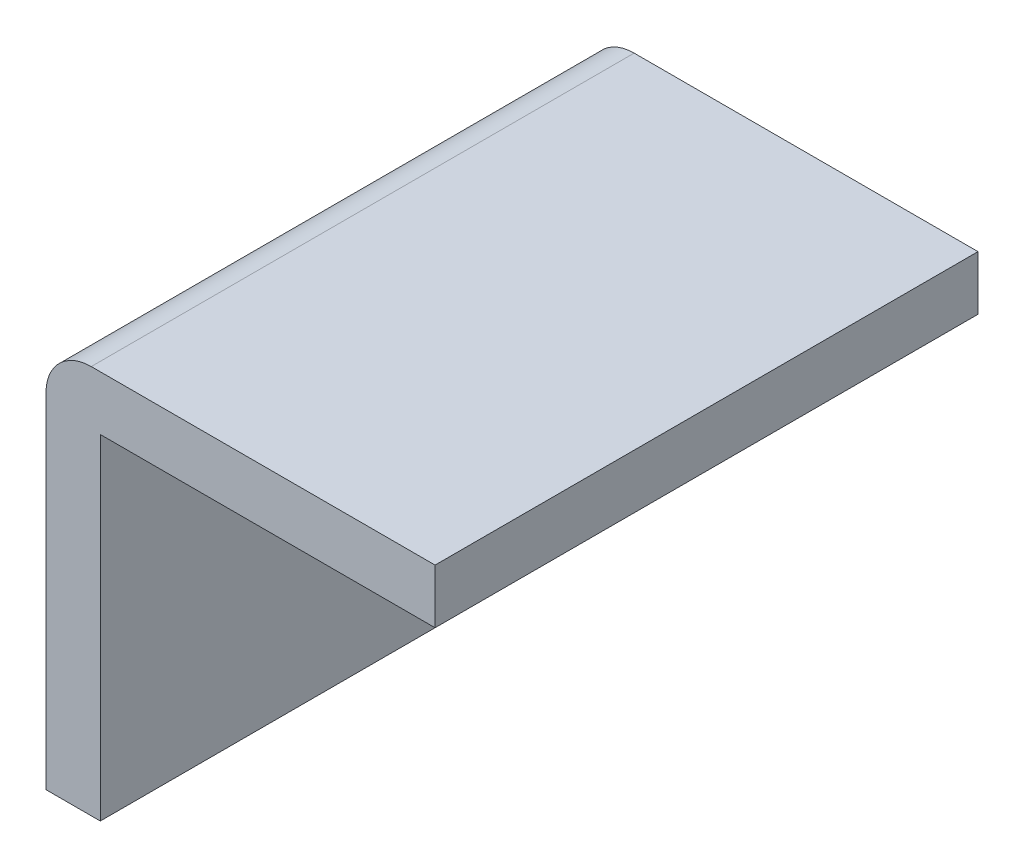
ISO-10303-21;
HEADER;
FILE_DESCRIPTION(('STEP AP214'),'2;1');
FILE_NAME('part.step','',(''),(''),'','','');
FILE_SCHEMA(('AUTOMOTIVE_DESIGN { 1 0 10303 214 1 1 1 1 }'));
ENDSEC;
DATA;
#1=APPLICATION_CONTEXT('core data for automotive mechanical design processes');
#2=APPLICATION_PROTOCOL_DEFINITION('international standard','automotive_design',2000,#1);
#3=PRODUCT_CONTEXT('',#1,'mechanical');
#4=PRODUCT('Part','Part','',(#3));
#5=PRODUCT_RELATED_PRODUCT_CATEGORY('part','',(#4));
#6=PRODUCT_DEFINITION_FORMATION('','',#4);
#7=PRODUCT_DEFINITION_CONTEXT('part definition',#1,'design');
#8=PRODUCT_DEFINITION('design','',#6,#7);
#9=PRODUCT_DEFINITION_SHAPE('','',#8);
#10=(LENGTH_UNIT() NAMED_UNIT(*) SI_UNIT(.MILLI.,.METRE.));
#11=(NAMED_UNIT(*) PLANE_ANGLE_UNIT() SI_UNIT($,.RADIAN.));
#12=(NAMED_UNIT(*) SI_UNIT($,.STERADIAN.) SOLID_ANGLE_UNIT());
#13=UNCERTAINTY_MEASURE_WITH_UNIT(LENGTH_MEASURE(1.E-05),#10,'distance_accuracy_value','');
#14=(GEOMETRIC_REPRESENTATION_CONTEXT(3) GLOBAL_UNCERTAINTY_ASSIGNED_CONTEXT((#13)) GLOBAL_UNIT_ASSIGNED_CONTEXT((#10,
#11,#12)) REPRESENTATION_CONTEXT('',''));
#15=CARTESIAN_POINT('',(0.,0.,0.));
#16=DIRECTION('',(0.,0.,1.));
#17=DIRECTION('',(1.,0.,0.));
#18=AXIS2_PLACEMENT_3D('',#15,#16,#17);
#19=CARTESIAN_POINT('',(-1.5,0.,30.));
#20=DIRECTION('',(-1.,0.,0.));
#21=DIRECTION('',(0.,0.,1.));
#22=AXIS2_PLACEMENT_3D('',#19,#20,#21);
#23=PLANE('',#22);
#24=DIRECTION('',(0.,1.,0.));
#25=VECTOR('',#24,1.);
#26=CARTESIAN_POINT('',(-1.5,0.,0.));
#27=LINE('',#26,#25);
#28=CARTESIAN_POINT('',(-1.5,0.,0.));
#29=VERTEX_POINT('',#28);
#30=CARTESIAN_POINT('',(-1.5,19.,0.));
#31=VERTEX_POINT('',#30);
#32=EDGE_CURVE('E125',#29,#31,#27,.T.);
#33=ORIENTED_EDGE('',*,*,#32,.F.);
#34=DIRECTION('',(0.,0.,-1.));
#35=VECTOR('',#34,1.);
#36=CARTESIAN_POINT('',(-1.5,0.,30.));
#37=LINE('',#36,#35);
#38=CARTESIAN_POINT('',(-1.5,0.,30.));
#39=VERTEX_POINT('',#38);
#40=EDGE_CURVE('E11',#39,#29,#37,.T.);
#41=ORIENTED_EDGE('',*,*,#40,.F.);
#42=DIRECTION('',(0.,1.,0.));
#43=VECTOR('',#42,1.);
#44=CARTESIAN_POINT('',(-1.5,0.,30.));
#45=LINE('',#44,#43);
#46=CARTESIAN_POINT('',(-1.5,19.,30.));
#47=VERTEX_POINT('',#46);
#48=EDGE_CURVE('E140',#39,#47,#45,.T.);
#49=ORIENTED_EDGE('',*,*,#48,.T.);
#50=DIRECTION('',(0.,0.,-1.));
#51=VECTOR('',#50,1.);
#52=CARTESIAN_POINT('',(-1.5,19.,30.));
#53=LINE('',#52,#51);
#54=EDGE_CURVE('E54',#47,#31,#53,.T.);
#55=ORIENTED_EDGE('',*,*,#54,.T.);
#56=EDGE_LOOP('',(#33,#41,#49,#55));
#57=FACE_BOUND('',#56,.T.);
#58=ADVANCED_FACE('F38',(#57),#23,.T.);
#59=CARTESIAN_POINT('',(0.,0.,30.));
#60=DIRECTION('',(0.,1.,0.));
#61=DIRECTION('',(0.,0.,1.));
#62=AXIS2_PLACEMENT_3D('',#59,#60,#61);
#63=PLANE('',#62);
#64=DIRECTION('',(1.,0.,0.));
#65=VECTOR('',#64,1.);
#66=CARTESIAN_POINT('',(0.,0.,0.));
#67=LINE('',#66,#65);
#68=CARTESIAN_POINT('',(1.5,0.,0.));
#69=VERTEX_POINT('',#68);
#70=EDGE_CURVE('E127',#29,#69,#67,.T.);
#71=ORIENTED_EDGE('',*,*,#70,.T.);
#72=DIRECTION('',(0.,0.,-1.));
#73=VECTOR('',#72,1.);
#74=CARTESIAN_POINT('',(1.5,0.,30.));
#75=LINE('',#74,#73);
#76=CARTESIAN_POINT('',(1.5,0.,30.));
#77=VERTEX_POINT('',#76);
#78=EDGE_CURVE('E46',#77,#69,#75,.T.);
#79=ORIENTED_EDGE('',*,*,#78,.F.);
#80=DIRECTION('',(1.,0.,0.));
#81=VECTOR('',#80,1.);
#82=CARTESIAN_POINT('',(0.,0.,30.));
#83=LINE('',#82,#81);
#84=EDGE_CURVE('E161',#39,#77,#83,.T.);
#85=ORIENTED_EDGE('',*,*,#84,.F.);
#86=ORIENTED_EDGE('',*,*,#40,.T.);
#87=EDGE_LOOP('',(#71,#79,#85,#86));
#88=FACE_BOUND('',#87,.T.);
#89=ADVANCED_FACE('F176',(#88),#63,.F.);
#90=CARTESIAN_POINT('',(1.5,0.,30.));
#91=DIRECTION('',(-1.,0.,0.));
#92=DIRECTION('',(0.,0.,1.));
#93=AXIS2_PLACEMENT_3D('',#90,#91,#92);
#94=PLANE('',#93);
#95=DIRECTION('',(0.,1.,0.));
#96=VECTOR('',#95,1.);
#97=CARTESIAN_POINT('',(1.5,0.,0.));
#98=LINE('',#97,#96);
#99=CARTESIAN_POINT('',(1.5,18.5,0.));
#100=VERTEX_POINT('',#99);
#101=EDGE_CURVE('E129',#69,#100,#98,.T.);
#102=ORIENTED_EDGE('',*,*,#101,.T.);
#103=DIRECTION('',(0.,0.,-1.));
#104=VECTOR('',#103,1.);
#105=CARTESIAN_POINT('',(1.5,18.5,30.));
#106=LINE('',#105,#104);
#107=CARTESIAN_POINT('',(1.5,18.5,30.));
#108=VERTEX_POINT('',#107);
#109=EDGE_CURVE('E144',#108,#100,#106,.T.);
#110=ORIENTED_EDGE('',*,*,#109,.F.);
#111=DIRECTION('',(0.,1.,0.));
#112=VECTOR('',#111,1.);
#113=CARTESIAN_POINT('',(1.5,0.,30.));
#114=LINE('',#113,#112);
#115=EDGE_CURVE('E153',#77,#108,#114,.T.);
#116=ORIENTED_EDGE('',*,*,#115,.F.);
#117=ORIENTED_EDGE('',*,*,#78,.T.);
#118=EDGE_LOOP('',(#102,#110,#116,#117));
#119=FACE_BOUND('',#118,.T.);
#120=ADVANCED_FACE('F151',(#119),#94,.F.);
#121=CARTESIAN_POINT('',(0.,18.5,30.));
#122=DIRECTION('',(0.,1.,0.));
#123=DIRECTION('',(0.,0.,1.));
#124=AXIS2_PLACEMENT_3D('',#121,#122,#123);
#125=PLANE('',#124);
#126=DIRECTION('',(1.,0.,0.));
#127=VECTOR('',#126,1.);
#128=CARTESIAN_POINT('',(0.,18.5,0.));
#129=LINE('',#128,#127);
#130=CARTESIAN_POINT('',(20.,18.5,0.));
#131=VERTEX_POINT('',#130);
#132=EDGE_CURVE('E131',#100,#131,#129,.T.);
#133=ORIENTED_EDGE('',*,*,#132,.T.);
#134=DIRECTION('',(0.,0.,-1.));
#135=VECTOR('',#134,1.);
#136=CARTESIAN_POINT('',(20.,18.5,30.));
#137=LINE('',#136,#135);
#138=CARTESIAN_POINT('',(20.,18.5,30.));
#139=VERTEX_POINT('',#138);
#140=EDGE_CURVE('E107',#139,#131,#137,.T.);
#141=ORIENTED_EDGE('',*,*,#140,.F.);
#142=DIRECTION('',(1.,0.,0.));
#143=VECTOR('',#142,1.);
#144=CARTESIAN_POINT('',(0.,18.5,30.));
#145=LINE('',#144,#143);
#146=EDGE_CURVE('E116',#108,#139,#145,.T.);
#147=ORIENTED_EDGE('',*,*,#146,.F.);
#148=ORIENTED_EDGE('',*,*,#109,.T.);
#149=EDGE_LOOP('',(#133,#141,#147,#148));
#150=FACE_BOUND('',#149,.T.);
#151=ADVANCED_FACE('F160',(#150),#125,.F.);
#152=CARTESIAN_POINT('',(20.,0.,30.));
#153=DIRECTION('',(1.,0.,0.));
#154=DIRECTION('',(0.,0.,-1.));
#155=AXIS2_PLACEMENT_3D('',#152,#153,#154);
#156=PLANE('',#155);
#157=DIRECTION('',(0.,-1.,0.));
#158=VECTOR('',#157,1.);
#159=CARTESIAN_POINT('',(20.,0.,0.));
#160=LINE('',#159,#158);
#161=CARTESIAN_POINT('',(20.,21.5,0.));
#162=VERTEX_POINT('',#161);
#163=EDGE_CURVE('E103',#162,#131,#160,.T.);
#164=ORIENTED_EDGE('',*,*,#163,.F.);
#165=DIRECTION('',(0.,0.,-1.));
#166=VECTOR('',#165,1.);
#167=CARTESIAN_POINT('',(20.,21.5,30.));
#168=LINE('',#167,#166);
#169=CARTESIAN_POINT('',(20.,21.5,30.));
#170=VERTEX_POINT('',#169);
#171=EDGE_CURVE('E98',#170,#162,#168,.T.);
#172=ORIENTED_EDGE('',*,*,#171,.F.);
#173=DIRECTION('',(0.,-1.,0.));
#174=VECTOR('',#173,1.);
#175=CARTESIAN_POINT('',(20.,0.,30.));
#176=LINE('',#175,#174);
#177=EDGE_CURVE('E101',#170,#139,#176,.T.);
#178=ORIENTED_EDGE('',*,*,#177,.T.);
#179=ORIENTED_EDGE('',*,*,#140,.T.);
#180=EDGE_LOOP('',(#164,#172,#178,#179));
#181=FACE_BOUND('',#180,.T.);
#182=ADVANCED_FACE('F100',(#181),#156,.T.);
#183=CARTESIAN_POINT('',(0.,21.5,30.));
#184=DIRECTION('',(0.,1.,0.));
#185=DIRECTION('',(-1.,0.,0.));
#186=AXIS2_PLACEMENT_3D('',#183,#184,#185);
#187=PLANE('',#186);
#188=DIRECTION('',(1.,0.,0.));
#189=VECTOR('',#188,1.);
#190=CARTESIAN_POINT('',(0.,21.5,0.));
#191=LINE('',#190,#189);
#192=CARTESIAN_POINT('',(1.,21.5,0.));
#193=VERTEX_POINT('',#192);
#194=EDGE_CURVE('E135',#193,#162,#191,.T.);
#195=ORIENTED_EDGE('',*,*,#194,.F.);
#196=DIRECTION('',(0.,0.,-1.));
#197=VECTOR('',#196,1.);
#198=CARTESIAN_POINT('',(1.,21.5,30.));
#199=LINE('',#198,#197);
#200=CARTESIAN_POINT('',(1.,21.5,30.));
#201=VERTEX_POINT('',#200);
#202=EDGE_CURVE('E76',#201,#193,#199,.T.);
#203=ORIENTED_EDGE('',*,*,#202,.F.);
#204=DIRECTION('',(1.,0.,0.));
#205=VECTOR('',#204,1.);
#206=CARTESIAN_POINT('',(0.,21.5,30.));
#207=LINE('',#206,#205);
#208=EDGE_CURVE('E114',#201,#170,#207,.T.);
#209=ORIENTED_EDGE('',*,*,#208,.T.);
#210=ORIENTED_EDGE('',*,*,#171,.T.);
#211=EDGE_LOOP('',(#195,#203,#209,#210));
#212=FACE_BOUND('',#211,.T.);
#213=ADVANCED_FACE('F119',(#212),#187,.T.);
#214=CARTESIAN_POINT('',(1.,19.,30.));
#215=DIRECTION('',(0.,0.,-1.));
#216=DIRECTION('',(-1.,0.,0.));
#217=AXIS2_PLACEMENT_3D('',#214,#215,#216);
#218=CYLINDRICAL_SURFACE('',#217,2.5);
#219=CARTESIAN_POINT('',(1.,19.,0.));
#220=DIRECTION('',(0.,0.,1.));
#221=DIRECTION('',(1.,0.,0.));
#222=AXIS2_PLACEMENT_3D('',#219,#220,#221);
#223=CIRCLE('',#222,2.5);
#224=EDGE_CURVE('E137',#31,#193,#223,.F.);
#225=ORIENTED_EDGE('',*,*,#224,.F.);
#226=ORIENTED_EDGE('',*,*,#54,.F.);
#227=CARTESIAN_POINT('',(1.,19.,30.));
#228=DIRECTION('',(0.,0.,1.));
#229=DIRECTION('',(1.,0.,0.));
#230=AXIS2_PLACEMENT_3D('',#227,#228,#229);
#231=CIRCLE('',#230,2.5);
#232=EDGE_CURVE('E120',#47,#201,#231,.F.);
#233=ORIENTED_EDGE('',*,*,#232,.T.);
#234=ORIENTED_EDGE('',*,*,#202,.T.);
#235=EDGE_LOOP('',(#225,#226,#233,#234));
#236=FACE_BOUND('',#235,.T.);
#237=ADVANCED_FACE('F165',(#236),#218,.T.);
#238=CARTESIAN_POINT('',(0.,0.,30.));
#239=DIRECTION('',(0.,0.,1.));
#240=DIRECTION('',(1.,0.,0.));
#241=AXIS2_PLACEMENT_3D('',#238,#239,#240);
#242=PLANE('',#241);
#243=ORIENTED_EDGE('',*,*,#48,.F.);
#244=ORIENTED_EDGE('',*,*,#84,.T.);
#245=ORIENTED_EDGE('',*,*,#115,.T.);
#246=ORIENTED_EDGE('',*,*,#146,.T.);
#247=ORIENTED_EDGE('',*,*,#177,.F.);
#248=ORIENTED_EDGE('',*,*,#208,.F.);
#249=ORIENTED_EDGE('',*,*,#232,.F.);
#250=EDGE_LOOP('',(#243,#244,#245,#246,#247,#248,#249));
#251=FACE_BOUND('',#250,.T.);
#252=ADVANCED_FACE('F112',(#251),#242,.T.);
#253=CARTESIAN_POINT('',(0.,0.,0.));
#254=DIRECTION('',(0.,0.,1.));
#255=DIRECTION('',(1.,0.,0.));
#256=AXIS2_PLACEMENT_3D('',#253,#254,#255);
#257=PLANE('',#256);
#258=ORIENTED_EDGE('',*,*,#32,.T.);
#259=ORIENTED_EDGE('',*,*,#224,.T.);
#260=ORIENTED_EDGE('',*,*,#194,.T.);
#261=ORIENTED_EDGE('',*,*,#163,.T.);
#262=ORIENTED_EDGE('',*,*,#132,.F.);
#263=ORIENTED_EDGE('',*,*,#101,.F.);
#264=ORIENTED_EDGE('',*,*,#70,.F.);
#265=EDGE_LOOP('',(#258,#259,#260,#261,#262,#263,#264));
#266=FACE_BOUND('',#265,.T.);
#267=ADVANCED_FACE('F158',(#266),#257,.F.);
#268=CLOSED_SHELL('',(#58,#89,#120,#151,#182,#213,#237,#252,#267));
#269=MANIFOLD_SOLID_BREP('B2',#268);
#270=ADVANCED_BREP_SHAPE_REPRESENTATION('',(#18,#269),#14);
#271=SHAPE_DEFINITION_REPRESENTATION(#9,#270);
ENDSEC;
END-ISO-10303-21;
